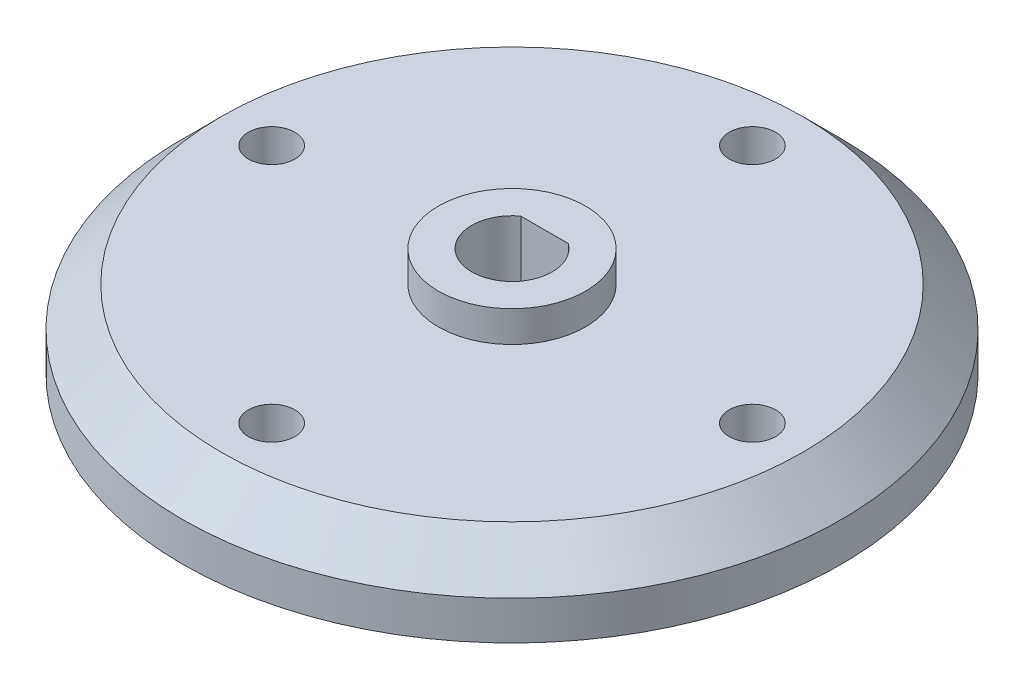
ISO-10303-21;
HEADER;
FILE_DESCRIPTION(('STEP AP214'),'2;1');
FILE_NAME('part.step','',(''),(''),'','','');
FILE_SCHEMA(('AUTOMOTIVE_DESIGN { 1 0 10303 214 1 1 1 1 }'));
ENDSEC;
DATA;
#1=APPLICATION_CONTEXT('core data for automotive mechanical design processes');
#2=APPLICATION_PROTOCOL_DEFINITION('international standard','automotive_design',2000,#1);
#3=PRODUCT_CONTEXT('',#1,'mechanical');
#4=PRODUCT('Part','Part','',(#3));
#5=PRODUCT_RELATED_PRODUCT_CATEGORY('part','',(#4));
#6=PRODUCT_DEFINITION_FORMATION('','',#4);
#7=PRODUCT_DEFINITION_CONTEXT('part definition',#1,'design');
#8=PRODUCT_DEFINITION('design','',#6,#7);
#9=PRODUCT_DEFINITION_SHAPE('','',#8);
#10=(LENGTH_UNIT() NAMED_UNIT(*) SI_UNIT(.MILLI.,.METRE.));
#11=(NAMED_UNIT(*) PLANE_ANGLE_UNIT() SI_UNIT($,.RADIAN.));
#12=(NAMED_UNIT(*) SI_UNIT($,.STERADIAN.) SOLID_ANGLE_UNIT());
#13=UNCERTAINTY_MEASURE_WITH_UNIT(LENGTH_MEASURE(1.E-05),#10,'distance_accuracy_value','');
#14=(GEOMETRIC_REPRESENTATION_CONTEXT(3) GLOBAL_UNCERTAINTY_ASSIGNED_CONTEXT((#13)) GLOBAL_UNIT_ASSIGNED_CONTEXT((#10,
#11,#12)) REPRESENTATION_CONTEXT('',''));
#15=CARTESIAN_POINT('',(0.,0.,0.));
#16=DIRECTION('',(0.,0.,1.));
#17=DIRECTION('',(1.,0.,0.));
#18=AXIS2_PLACEMENT_3D('',#15,#16,#17);
#19=CARTESIAN_POINT('',(0.,5.,0.));
#20=DIRECTION('',(0.,1.,0.));
#21=DIRECTION('',(0.,0.,1.));
#22=AXIS2_PLACEMENT_3D('',#19,#20,#21);
#23=PLANE('',#22);
#24=CARTESIAN_POINT('',(-15.5,5.,0.));
#25=DIRECTION('',(0.,1.,0.));
#26=DIRECTION('',(0.,0.,1.));
#27=AXIS2_PLACEMENT_3D('',#24,#25,#26);
#28=CIRCLE('',#27,1.5);
#29=CARTESIAN_POINT('',(-15.5,5.,1.5));
#30=VERTEX_POINT('',#29);
#31=EDGE_CURVE('E101',#30,#30,#28,.T.);
#32=ORIENTED_EDGE('',*,*,#31,.F.);
#33=EDGE_LOOP('',(#32));
#34=FACE_BOUND('',#33,.T.);
#35=CARTESIAN_POINT('',(15.5,5.,0.));
#36=DIRECTION('',(0.,1.,0.));
#37=DIRECTION('',(0.,0.,1.));
#38=AXIS2_PLACEMENT_3D('',#35,#36,#37);
#39=CIRCLE('',#38,1.5);
#40=CARTESIAN_POINT('',(15.5,5.,1.5));
#41=VERTEX_POINT('',#40);
#42=EDGE_CURVE('E117',#41,#41,#39,.T.);
#43=ORIENTED_EDGE('',*,*,#42,.F.);
#44=EDGE_LOOP('',(#43));
#45=FACE_BOUND('',#44,.T.);
#46=CARTESIAN_POINT('',(0.,5.,-15.5));
#47=DIRECTION('',(0.,1.,0.));
#48=DIRECTION('',(0.,0.,1.));
#49=AXIS2_PLACEMENT_3D('',#46,#47,#48);
#50=CIRCLE('',#49,1.5);
#51=CARTESIAN_POINT('',(0.,5.,-14.));
#52=VERTEX_POINT('',#51);
#53=EDGE_CURVE('E125',#52,#52,#50,.T.);
#54=ORIENTED_EDGE('',*,*,#53,.F.);
#55=EDGE_LOOP('',(#54));
#56=FACE_BOUND('',#55,.T.);
#57=CARTESIAN_POINT('',(0.,5.,15.5));
#58=DIRECTION('',(0.,1.,0.));
#59=DIRECTION('',(0.,0.,1.));
#60=AXIS2_PLACEMENT_3D('',#57,#58,#59);
#61=CIRCLE('',#60,1.5);
#62=CARTESIAN_POINT('',(0.,5.,17.));
#63=VERTEX_POINT('',#62);
#64=EDGE_CURVE('E109',#63,#63,#61,.T.);
#65=ORIENTED_EDGE('',*,*,#64,.F.);
#66=EDGE_LOOP('',(#65));
#67=FACE_BOUND('',#66,.T.);
#68=CARTESIAN_POINT('',(0.,5.,0.));
#69=DIRECTION('',(0.,1.,0.));
#70=DIRECTION('',(0.,0.,1.));
#71=AXIS2_PLACEMENT_3D('',#68,#69,#70);
#72=CIRCLE('',#71,18.75);
#73=CARTESIAN_POINT('',(0.,5.,-18.75));
#74=VERTEX_POINT('',#73);
#75=EDGE_CURVE('E55',#74,#74,#72,.T.);
#76=ORIENTED_EDGE('',*,*,#75,.T.);
#77=EDGE_LOOP('',(#76));
#78=FACE_BOUND('',#77,.T.);
#79=CARTESIAN_POINT('',(0.,5.,0.));
#80=DIRECTION('',(0.,1.,0.));
#81=DIRECTION('',(0.,0.,1.));
#82=AXIS2_PLACEMENT_3D('',#79,#80,#81);
#83=CIRCLE('',#82,4.75);
#84=CARTESIAN_POINT('',(0.,5.,4.75));
#85=VERTEX_POINT('',#84);
#86=EDGE_CURVE('E87',#85,#85,#83,.T.);
#87=ORIENTED_EDGE('',*,*,#86,.F.);
#88=EDGE_LOOP('',(#87));
#89=FACE_BOUND('',#88,.T.);
#90=ADVANCED_FACE('F45',(#34,#45,#56,#67,#78,#89),#23,.T.);
#91=CARTESIAN_POINT('',(0.,0.,0.));
#92=DIRECTION('',(0.,1.,0.));
#93=DIRECTION('',(0.,0.,1.));
#94=AXIS2_PLACEMENT_3D('',#91,#92,#93);
#95=PLANE('',#94);
#96=CARTESIAN_POINT('',(0.,0.,0.));
#97=DIRECTION('',(0.,1.,0.));
#98=DIRECTION('',(0.,0.,1.));
#99=AXIS2_PLACEMENT_3D('',#96,#97,#98);
#100=CIRCLE('',#99,21.25);
#101=CARTESIAN_POINT('',(0.,0.,21.25));
#102=VERTEX_POINT('',#101);
#103=EDGE_CURVE('E138',#102,#102,#100,.T.);
#104=ORIENTED_EDGE('',*,*,#103,.F.);
#105=EDGE_LOOP('',(#104));
#106=FACE_BOUND('',#105,.T.);
#107=CARTESIAN_POINT('',(0.,0.,0.));
#108=DIRECTION('',(0.,1.,0.));
#109=DIRECTION('',(0.,0.,1.));
#110=AXIS2_PLACEMENT_3D('',#107,#108,#109);
#111=CIRCLE('',#110,2.6);
#112=CARTESIAN_POINT('',(-1.53297097167559,0.,-2.1));
#113=VERTEX_POINT('',#112);
#114=CARTESIAN_POINT('',(1.53297097167559,0.,-2.1));
#115=VERTEX_POINT('',#114);
#116=EDGE_CURVE('E62',#113,#115,#111,.T.);
#117=ORIENTED_EDGE('',*,*,#116,.T.);
#118=DIRECTION('',(-1.,0.,0.));
#119=VECTOR('',#118,1.);
#120=CARTESIAN_POINT('',(-1.53297097167559,0.,-2.1));
#121=LINE('',#120,#119);
#122=EDGE_CURVE('E69',#115,#113,#121,.T.);
#123=ORIENTED_EDGE('',*,*,#122,.T.);
#124=EDGE_LOOP('',(#117,#123));
#125=FACE_BOUND('',#124,.T.);
#126=CARTESIAN_POINT('',(0.,0.,-15.5));
#127=DIRECTION('',(0.,1.,0.));
#128=DIRECTION('',(0.,0.,1.));
#129=AXIS2_PLACEMENT_3D('',#126,#127,#128);
#130=CIRCLE('',#129,1.5);
#131=CARTESIAN_POINT('',(0.,0.,-14.));
#132=VERTEX_POINT('',#131);
#133=EDGE_CURVE('E121',#132,#132,#130,.T.);
#134=ORIENTED_EDGE('',*,*,#133,.T.);
#135=EDGE_LOOP('',(#134));
#136=FACE_BOUND('',#135,.T.);
#137=CARTESIAN_POINT('',(15.5,0.,0.));
#138=DIRECTION('',(0.,1.,0.));
#139=DIRECTION('',(0.,0.,1.));
#140=AXIS2_PLACEMENT_3D('',#137,#138,#139);
#141=CIRCLE('',#140,1.5);
#142=CARTESIAN_POINT('',(15.5,0.,1.5));
#143=VERTEX_POINT('',#142);
#144=EDGE_CURVE('E113',#143,#143,#141,.T.);
#145=ORIENTED_EDGE('',*,*,#144,.T.);
#146=EDGE_LOOP('',(#145));
#147=FACE_BOUND('',#146,.T.);
#148=CARTESIAN_POINT('',(0.,0.,15.5));
#149=DIRECTION('',(0.,1.,0.));
#150=DIRECTION('',(0.,0.,1.));
#151=AXIS2_PLACEMENT_3D('',#148,#149,#150);
#152=CIRCLE('',#151,1.5);
#153=CARTESIAN_POINT('',(0.,0.,17.));
#154=VERTEX_POINT('',#153);
#155=EDGE_CURVE('E105',#154,#154,#152,.T.);
#156=ORIENTED_EDGE('',*,*,#155,.T.);
#157=EDGE_LOOP('',(#156));
#158=FACE_BOUND('',#157,.T.);
#159=CARTESIAN_POINT('',(-15.5,0.,0.));
#160=DIRECTION('',(0.,1.,0.));
#161=DIRECTION('',(0.,0.,1.));
#162=AXIS2_PLACEMENT_3D('',#159,#160,#161);
#163=CIRCLE('',#162,1.5);
#164=CARTESIAN_POINT('',(-15.5,0.,1.5));
#165=VERTEX_POINT('',#164);
#166=EDGE_CURVE('E97',#165,#165,#163,.T.);
#167=ORIENTED_EDGE('',*,*,#166,.T.);
#168=EDGE_LOOP('',(#167));
#169=FACE_BOUND('',#168,.T.);
#170=ADVANCED_FACE('F162',(#106,#125,#136,#147,#158,#169),#95,.F.);
#171=CARTESIAN_POINT('',(0.,5.,0.));
#172=DIRECTION('',(0.,-1.,0.));
#173=DIRECTION('',(0.,0.,-1.));
#174=AXIS2_PLACEMENT_3D('',#171,#172,#173);
#175=CYLINDRICAL_SURFACE('',#174,21.25);
#176=CARTESIAN_POINT('',(0.,2.49999999999997,0.));
#177=DIRECTION('',(0.,1.,0.));
#178=DIRECTION('',(0.,0.,1.));
#179=AXIS2_PLACEMENT_3D('',#176,#177,#178);
#180=CIRCLE('',#179,21.25);
#181=CARTESIAN_POINT('',(0.,2.49999999999997,-21.25));
#182=VERTEX_POINT('',#181);
#183=EDGE_CURVE('E11',#182,#182,#180,.F.);
#184=ORIENTED_EDGE('',*,*,#183,.T.);
#185=EDGE_LOOP('',(#184));
#186=FACE_BOUND('',#185,.T.);
#187=ORIENTED_EDGE('',*,*,#103,.T.);
#188=EDGE_LOOP('',(#187));
#189=FACE_BOUND('',#188,.T.);
#190=ADVANCED_FACE('F168',(#186,#189),#175,.T.);
#191=CARTESIAN_POINT('',(0.,5.,0.));
#192=DIRECTION('',(0.,-1.,0.));
#193=DIRECTION('',(0.,0.,-1.));
#194=AXIS2_PLACEMENT_3D('',#191,#192,#193);
#195=CYLINDRICAL_SURFACE('',#194,2.6);
#196=ORIENTED_EDGE('',*,*,#116,.F.);
#197=DIRECTION('',(0.,-1.,0.));
#198=VECTOR('',#197,1.);
#199=CARTESIAN_POINT('',(-1.53297097167559,5.,-2.1));
#200=LINE('',#199,#198);
#201=CARTESIAN_POINT('',(-1.53297097167559,7.,-2.1));
#202=VERTEX_POINT('',#201);
#203=EDGE_CURVE('E74',#202,#113,#200,.T.);
#204=ORIENTED_EDGE('',*,*,#203,.F.);
#205=CARTESIAN_POINT('',(0.,7.,0.));
#206=DIRECTION('',(0.,1.,0.));
#207=DIRECTION('',(0.,0.,1.));
#208=AXIS2_PLACEMENT_3D('',#205,#206,#207);
#209=CIRCLE('',#208,2.6);
#210=CARTESIAN_POINT('',(1.53297097167559,7.,-2.1));
#211=VERTEX_POINT('',#210);
#212=EDGE_CURVE('E78',#202,#211,#209,.T.);
#213=ORIENTED_EDGE('',*,*,#212,.T.);
#214=DIRECTION('',(0.,-1.,0.));
#215=VECTOR('',#214,1.);
#216=CARTESIAN_POINT('',(1.53297097167559,5.,-2.1));
#217=LINE('',#216,#215);
#218=EDGE_CURVE('E81',#211,#115,#217,.T.);
#219=ORIENTED_EDGE('',*,*,#218,.T.);
#220=EDGE_LOOP('',(#196,#204,#213,#219));
#221=FACE_BOUND('',#220,.T.);
#222=ADVANCED_FACE('F76',(#221),#195,.F.);
#223=CARTESIAN_POINT('',(-1.53297097167559,5.,-2.1));
#224=DIRECTION('',(0.,0.,1.));
#225=DIRECTION('',(1.,0.,0.));
#226=AXIS2_PLACEMENT_3D('',#223,#224,#225);
#227=PLANE('',#226);
#228=ORIENTED_EDGE('',*,*,#122,.F.);
#229=ORIENTED_EDGE('',*,*,#218,.F.);
#230=DIRECTION('',(-1.,0.,0.));
#231=VECTOR('',#230,1.);
#232=CARTESIAN_POINT('',(1.53297097167559,7.,-2.1));
#233=LINE('',#232,#231);
#234=EDGE_CURVE('E83',#211,#202,#233,.T.);
#235=ORIENTED_EDGE('',*,*,#234,.T.);
#236=ORIENTED_EDGE('',*,*,#203,.T.);
#237=EDGE_LOOP('',(#228,#229,#235,#236));
#238=FACE_BOUND('',#237,.T.);
#239=ADVANCED_FACE('F84',(#238),#227,.T.);
#240=CARTESIAN_POINT('',(0.,5.,-15.5));
#241=DIRECTION('',(0.,-1.,0.));
#242=DIRECTION('',(0.,0.,-1.));
#243=AXIS2_PLACEMENT_3D('',#240,#241,#242);
#244=CYLINDRICAL_SURFACE('',#243,1.5);
#245=ORIENTED_EDGE('',*,*,#53,.T.);
#246=EDGE_LOOP('',(#245));
#247=FACE_BOUND('',#246,.T.);
#248=ORIENTED_EDGE('',*,*,#133,.F.);
#249=EDGE_LOOP('',(#248));
#250=FACE_BOUND('',#249,.T.);
#251=ADVANCED_FACE('F200',(#247,#250),#244,.F.);
#252=CARTESIAN_POINT('',(15.5,5.,0.));
#253=DIRECTION('',(0.,-1.,0.));
#254=DIRECTION('',(0.,0.,-1.));
#255=AXIS2_PLACEMENT_3D('',#252,#253,#254);
#256=CYLINDRICAL_SURFACE('',#255,1.5);
#257=ORIENTED_EDGE('',*,*,#42,.T.);
#258=EDGE_LOOP('',(#257));
#259=FACE_BOUND('',#258,.T.);
#260=ORIENTED_EDGE('',*,*,#144,.F.);
#261=EDGE_LOOP('',(#260));
#262=FACE_BOUND('',#261,.T.);
#263=ADVANCED_FACE('F194',(#259,#262),#256,.F.);
#264=CARTESIAN_POINT('',(0.,5.,15.5));
#265=DIRECTION('',(0.,-1.,0.));
#266=DIRECTION('',(0.,0.,-1.));
#267=AXIS2_PLACEMENT_3D('',#264,#265,#266);
#268=CYLINDRICAL_SURFACE('',#267,1.5);
#269=ORIENTED_EDGE('',*,*,#64,.T.);
#270=EDGE_LOOP('',(#269));
#271=FACE_BOUND('',#270,.T.);
#272=ORIENTED_EDGE('',*,*,#155,.F.);
#273=EDGE_LOOP('',(#272));
#274=FACE_BOUND('',#273,.T.);
#275=ADVANCED_FACE('F157',(#271,#274),#268,.F.);
#276=CARTESIAN_POINT('',(-15.5,5.,0.));
#277=DIRECTION('',(0.,-1.,0.));
#278=DIRECTION('',(0.,0.,-1.));
#279=AXIS2_PLACEMENT_3D('',#276,#277,#278);
#280=CYLINDRICAL_SURFACE('',#279,1.5);
#281=ORIENTED_EDGE('',*,*,#31,.T.);
#282=EDGE_LOOP('',(#281));
#283=FACE_BOUND('',#282,.T.);
#284=ORIENTED_EDGE('',*,*,#166,.F.);
#285=EDGE_LOOP('',(#284));
#286=FACE_BOUND('',#285,.T.);
#287=ADVANCED_FACE('F148',(#283,#286),#280,.F.);
#288=CARTESIAN_POINT('',(0.,5.,0.));
#289=DIRECTION('',(0.,-1.,0.));
#290=DIRECTION('',(0.,0.,-1.));
#291=AXIS2_PLACEMENT_3D('',#288,#289,#290);
#292=CONICAL_SURFACE('',#291,18.75,0.785398163397445);
#293=CARTESIAN_POINT('',(0.,2.49999999999997,-21.25));
#294=CARTESIAN_POINT('',(0.,2.52604166666664,-21.2239583333333));
#295=CARTESIAN_POINT('',(0.,2.55208333333331,-21.1979166666667));
#296=CARTESIAN_POINT('',(0.,2.60416666666664,-21.1458333333333));
#297=CARTESIAN_POINT('',(0.,2.63020833333331,-21.1197916666667));
#298=CARTESIAN_POINT('',(0.,2.68229166666664,-21.0677083333333));
#299=CARTESIAN_POINT('',(0.,2.70833333333331,-21.0416666666667));
#300=CARTESIAN_POINT('',(0.,2.76041666666664,-20.9895833333333));
#301=CARTESIAN_POINT('',(0.,2.78645833333331,-20.9635416666667));
#302=CARTESIAN_POINT('',(0.,2.83854166666664,-20.9114583333333));
#303=CARTESIAN_POINT('',(0.,2.86458333333331,-20.8854166666667));
#304=CARTESIAN_POINT('',(0.,2.91666666666664,-20.8333333333333));
#305=CARTESIAN_POINT('',(0.,2.94270833333331,-20.8072916666667));
#306=CARTESIAN_POINT('',(0.,2.99479166666664,-20.7552083333333));
#307=CARTESIAN_POINT('',(0.,3.02083333333331,-20.7291666666667));
#308=CARTESIAN_POINT('',(0.,3.07291666666665,-20.6770833333333));
#309=CARTESIAN_POINT('',(0.,3.09895833333331,-20.6510416666667));
#310=CARTESIAN_POINT('',(0.,3.15104166666665,-20.5989583333333));
#311=CARTESIAN_POINT('',(0.,3.17708333333331,-20.5729166666667));
#312=CARTESIAN_POINT('',(0.,3.22916666666665,-20.5208333333333));
#313=CARTESIAN_POINT('',(0.,3.25520833333331,-20.4947916666667));
#314=CARTESIAN_POINT('',(0.,3.30729166666665,-20.4427083333333));
#315=CARTESIAN_POINT('',(0.,3.33333333333331,-20.4166666666667));
#316=CARTESIAN_POINT('',(0.,3.38541666666665,-20.3645833333333));
#317=CARTESIAN_POINT('',(0.,3.41145833333332,-20.3385416666667));
#318=CARTESIAN_POINT('',(0.,3.46354166666665,-20.2864583333333));
#319=CARTESIAN_POINT('',(0.,3.48958333333332,-20.2604166666667));
#320=CARTESIAN_POINT('',(0.,3.54166666666665,-20.2083333333333));
#321=CARTESIAN_POINT('',(0.,3.56770833333332,-20.1822916666667));
#322=CARTESIAN_POINT('',(0.,3.61979166666665,-20.1302083333333));
#323=CARTESIAN_POINT('',(0.,3.64583333333332,-20.1041666666667));
#324=CARTESIAN_POINT('',(0.,3.69791666666665,-20.0520833333333));
#325=CARTESIAN_POINT('',(0.,3.72395833333332,-20.0260416666667));
#326=CARTESIAN_POINT('',(0.,3.77604166666665,-19.9739583333333));
#327=CARTESIAN_POINT('',(0.,3.80208333333332,-19.9479166666667));
#328=CARTESIAN_POINT('',(0.,3.85416666666665,-19.8958333333333));
#329=CARTESIAN_POINT('',(0.,3.88020833333332,-19.8697916666667));
#330=CARTESIAN_POINT('',(0.,3.93229166666665,-19.8177083333333));
#331=CARTESIAN_POINT('',(0.,3.95833333333332,-19.7916666666667));
#332=CARTESIAN_POINT('',(0.,4.01041666666666,-19.7395833333333));
#333=CARTESIAN_POINT('',(0.,4.03645833333332,-19.7135416666667));
#334=CARTESIAN_POINT('',(0.,4.08854166666666,-19.6614583333333));
#335=CARTESIAN_POINT('',(0.,4.11458333333332,-19.6354166666667));
#336=CARTESIAN_POINT('',(0.,4.16666666666666,-19.5833333333333));
#337=CARTESIAN_POINT('',(0.,4.19270833333332,-19.5572916666667));
#338=CARTESIAN_POINT('',(0.,4.24479166666666,-19.5052083333333));
#339=CARTESIAN_POINT('',(0.,4.27083333333332,-19.4791666666667));
#340=CARTESIAN_POINT('',(0.,4.32291666666666,-19.4270833333333));
#341=CARTESIAN_POINT('',(0.,4.34895833333333,-19.4010416666667));
#342=CARTESIAN_POINT('',(0.,4.40104166666666,-19.3489583333333));
#343=CARTESIAN_POINT('',(0.,4.42708333333333,-19.3229166666667));
#344=CARTESIAN_POINT('',(0.,4.47916666666666,-19.2708333333333));
#345=CARTESIAN_POINT('',(0.,4.50520833333333,-19.2447916666667));
#346=CARTESIAN_POINT('',(0.,4.55729166666666,-19.1927083333333));
#347=CARTESIAN_POINT('',(0.,4.58333333333333,-19.1666666666667));
#348=CARTESIAN_POINT('',(0.,4.63541666666666,-19.1145833333333));
#349=CARTESIAN_POINT('',(0.,4.66145833333333,-19.0885416666667));
#350=CARTESIAN_POINT('',(0.,4.71354166666666,-19.0364583333333));
#351=CARTESIAN_POINT('',(0.,4.73958333333333,-19.0104166666667));
#352=CARTESIAN_POINT('',(0.,4.79166666666666,-18.9583333333333));
#353=CARTESIAN_POINT('',(0.,4.81770833333333,-18.9322916666667));
#354=CARTESIAN_POINT('',(0.,4.86979166666666,-18.8802083333333));
#355=CARTESIAN_POINT('',(0.,4.89583333333333,-18.8541666666667));
#356=CARTESIAN_POINT('',(0.,4.94791666666667,-18.8020833333333));
#357=CARTESIAN_POINT('',(0.,4.97395833333333,-18.7760416666667));
#358=CARTESIAN_POINT('',(0.,5.,-18.75));
#359=B_SPLINE_CURVE_WITH_KNOTS('',3,(#293,#294,#295,#296,#297,#298,#299,#300,#301,#302,#303,
#304,#305,#306,#307,#308,#309,#310,#311,#312,#313,#314,#315,#316,#317,#318,#319,#320,#321,#322,
#323,#324,#325,#326,#327,#328,#329,#330,#331,#332,#333,#334,#335,#336,#337,#338,#339,#340,#341,
#342,#343,#344,#345,#346,#347,#348,#349,#350,#351,#352,#353,#354,#355,#356,#357,#358),
.UNSPECIFIED.,.F.,.F.,(4,2,2,2,2,2,2,2,2,2,2,2,2,2,2,2,2,2,2,2,2,2,2,2,2,2,2,2,2,2,2,2,4),(0.,
0.110485434560398,0.220970869120798,0.331456303681195,0.441941738241595,0.552427172801992,
0.662912607362392,0.773398041922792,0.88388347648319,0.99436891104359,1.10485434560399,
1.21533978016439,1.32582521472478,1.43631064928518,1.54679608384558,1.65728151840598,
1.76776695296638,1.87825238752678,1.98873782208718,2.09922325664758,2.20970869120798,
2.32019412576838,2.43067956032877,2.54116499488917,2.65165042944957,2.76213586400997,
2.87262129857037,2.98310673313077,3.09359216769117,3.20407760225157,3.31456303681197,
3.42504847137236,3.53553390593276),.UNSPECIFIED.);
#360=EDGE_CURVE('BSEAM48',#182,#74,#359,.T.);
#361=ORIENTED_EDGE('',*,*,#183,.F.);
#362=ORIENTED_EDGE('',*,*,#75,.F.);
#363=ORIENTED_EDGE('',*,*,#360,.T.);
#364=ORIENTED_EDGE('',*,*,#360,.F.);
#365=EDGE_LOOP('',(#361,#363,#362,#364));
#366=FACE_BOUND('',#365,.T.);
#367=ADVANCED_FACE('F48',(#366),#292,.T.);
#368=CARTESIAN_POINT('',(0.,7.,0.));
#369=DIRECTION('',(0.,1.,0.));
#370=DIRECTION('',(0.,0.,1.));
#371=AXIS2_PLACEMENT_3D('',#368,#369,#370);
#372=PLANE('',#371);
#373=CARTESIAN_POINT('',(0.,7.,0.));
#374=DIRECTION('',(0.,1.,0.));
#375=DIRECTION('',(0.,0.,1.));
#376=AXIS2_PLACEMENT_3D('',#373,#374,#375);
#377=CIRCLE('',#376,4.75);
#378=CARTESIAN_POINT('',(0.,7.,4.75));
#379=VERTEX_POINT('',#378);
#380=EDGE_CURVE('E93',#379,#379,#377,.T.);
#381=ORIENTED_EDGE('',*,*,#380,.T.);
#382=EDGE_LOOP('',(#381));
#383=FACE_BOUND('',#382,.T.);
#384=ORIENTED_EDGE('',*,*,#234,.F.);
#385=ORIENTED_EDGE('',*,*,#212,.F.);
#386=EDGE_LOOP('',(#384,#385));
#387=FACE_BOUND('',#386,.T.);
#388=ADVANCED_FACE('F89',(#383,#387),#372,.T.);
#389=CARTESIAN_POINT('',(0.,7.,0.));
#390=DIRECTION('',(0.,-1.,0.));
#391=DIRECTION('',(0.,0.,-1.));
#392=AXIS2_PLACEMENT_3D('',#389,#390,#391);
#393=CYLINDRICAL_SURFACE('',#392,4.75);
#394=ORIENTED_EDGE('',*,*,#380,.F.);
#395=EDGE_LOOP('',(#394));
#396=FACE_BOUND('',#395,.T.);
#397=ORIENTED_EDGE('',*,*,#86,.T.);
#398=EDGE_LOOP('',(#397));
#399=FACE_BOUND('',#398,.T.);
#400=ADVANCED_FACE('F154',(#396,#399),#393,.T.);
#401=CLOSED_SHELL('',(#90,#170,#190,#222,#239,#251,#263,#275,#287,#367,#388,#400));
#402=MANIFOLD_SOLID_BREP('B2',#401);
#403=ADVANCED_BREP_SHAPE_REPRESENTATION('',(#18,#402),#14);
#404=SHAPE_DEFINITION_REPRESENTATION(#9,#403);
ENDSEC;
END-ISO-10303-21;
